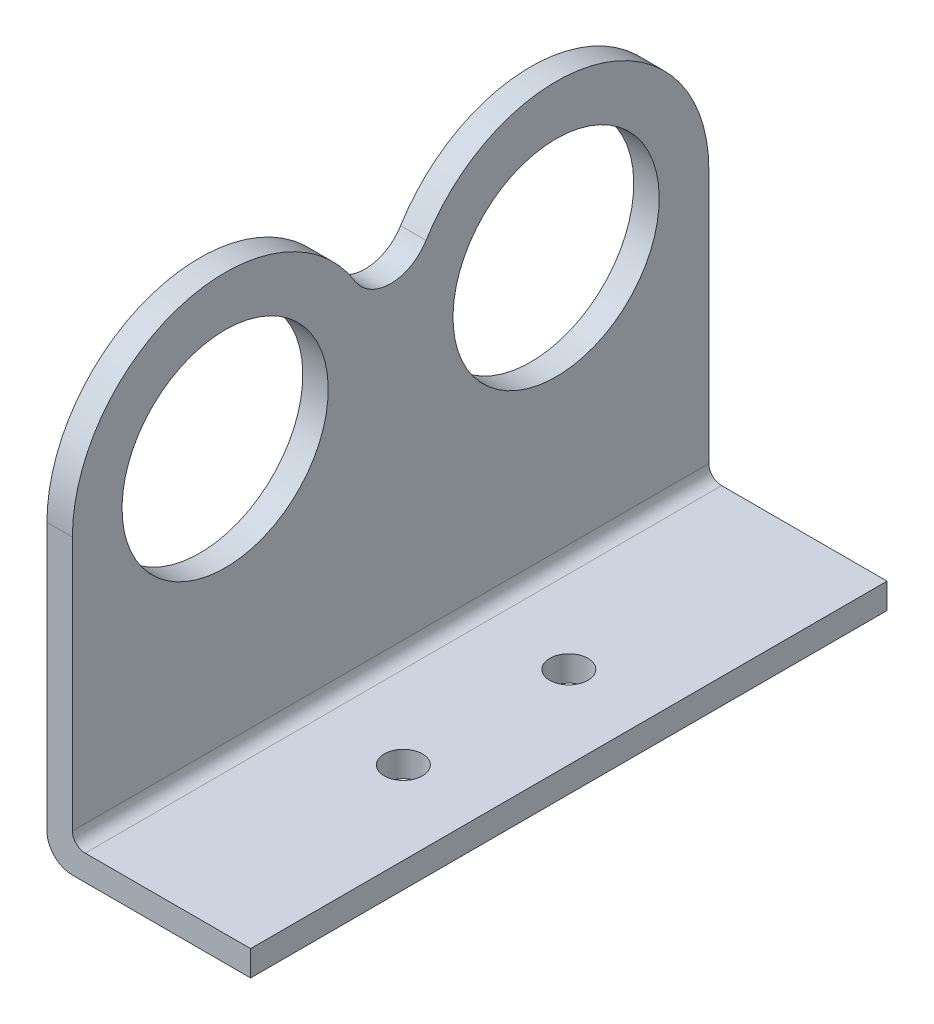
ISO-10303-21;
HEADER;
FILE_DESCRIPTION(('STEP AP214'),'2;1');
FILE_NAME('part.step','',(''),(''),'','','');
FILE_SCHEMA(('AUTOMOTIVE_DESIGN { 1 0 10303 214 1 1 1 1 }'));
ENDSEC;
DATA;
#1=APPLICATION_CONTEXT('core data for automotive mechanical design processes');
#2=APPLICATION_PROTOCOL_DEFINITION('international standard','automotive_design',2000,#1);
#3=PRODUCT_CONTEXT('',#1,'mechanical');
#4=PRODUCT('Part','Part','',(#3));
#5=PRODUCT_RELATED_PRODUCT_CATEGORY('part','',(#4));
#6=PRODUCT_DEFINITION_FORMATION('','',#4);
#7=PRODUCT_DEFINITION_CONTEXT('part definition',#1,'design');
#8=PRODUCT_DEFINITION('design','',#6,#7);
#9=PRODUCT_DEFINITION_SHAPE('','',#8);
#10=(LENGTH_UNIT() NAMED_UNIT(*) SI_UNIT(.MILLI.,.METRE.));
#11=(NAMED_UNIT(*) PLANE_ANGLE_UNIT() SI_UNIT($,.RADIAN.));
#12=(NAMED_UNIT(*) SI_UNIT($,.STERADIAN.) SOLID_ANGLE_UNIT());
#13=UNCERTAINTY_MEASURE_WITH_UNIT(LENGTH_MEASURE(1.E-05),#10,'distance_accuracy_value','');
#14=(GEOMETRIC_REPRESENTATION_CONTEXT(3) GLOBAL_UNCERTAINTY_ASSIGNED_CONTEXT((#13)) GLOBAL_UNIT_ASSIGNED_CONTEXT((#10,
#11,#12)) REPRESENTATION_CONTEXT('',''));
#15=CARTESIAN_POINT('',(0.,0.,0.));
#16=DIRECTION('',(0.,0.,1.));
#17=DIRECTION('',(1.,0.,0.));
#18=AXIS2_PLACEMENT_3D('',#15,#16,#17);
#19=CARTESIAN_POINT('',(0.,35.,50.));
#20=DIRECTION('',(1.,0.,0.));
#21=DIRECTION('',(0.,1.,0.));
#22=AXIS2_PLACEMENT_3D('',#19,#20,#21);
#23=PLANE('',#22);
#24=CARTESIAN_POINT('',(0.,23.,38.));
#25=DIRECTION('',(1.,0.,0.));
#26=DIRECTION('',(0.,1.,0.));
#27=AXIS2_PLACEMENT_3D('',#24,#25,#26);
#28=CIRCLE('',#27,8.1);
#29=CARTESIAN_POINT('',(0.,31.1,38.));
#30=VERTEX_POINT('',#29);
#31=EDGE_CURVE('E227',#30,#30,#28,.T.);
#32=ORIENTED_EDGE('',*,*,#31,.T.);
#33=EDGE_LOOP('',(#32));
#34=FACE_BOUND('',#33,.T.);
#35=CARTESIAN_POINT('',(0.,23.,12.));
#36=DIRECTION('',(1.,0.,0.));
#37=DIRECTION('',(0.,1.,0.));
#38=AXIS2_PLACEMENT_3D('',#35,#36,#37);
#39=CIRCLE('',#38,8.1);
#40=CARTESIAN_POINT('',(0.,31.1,12.));
#41=VERTEX_POINT('',#40);
#42=EDGE_CURVE('E224',#41,#41,#39,.T.);
#43=ORIENTED_EDGE('',*,*,#42,.T.);
#44=EDGE_LOOP('',(#43));
#45=FACE_BOUND('',#44,.T.);
#46=CARTESIAN_POINT('',(0.,23.,38.));
#47=DIRECTION('',(1.,0.,0.));
#48=DIRECTION('',(0.,1.,0.));
#49=AXIS2_PLACEMENT_3D('',#46,#47,#48);
#50=CIRCLE('',#49,12.);
#51=CARTESIAN_POINT('',(0.,29.289169107972,27.7801001995455));
#52=VERTEX_POINT('',#51);
#53=CARTESIAN_POINT('',(0.,23.,50.));
#54=VERTEX_POINT('',#53);
#55=EDGE_CURVE('E126',#52,#54,#50,.T.);
#56=ORIENTED_EDGE('',*,*,#55,.F.);
#57=CARTESIAN_POINT('',(0.,31.,25.));
#58=DIRECTION('',(1.,0.,0.));
#59=DIRECTION('',(0.,1.,0.));
#60=AXIS2_PLACEMENT_3D('',#57,#58,#59);
#61=CIRCLE('',#60,3.26433752247375);
#62=CARTESIAN_POINT('',(0.,29.289169107972,22.2198998004545));
#63=VERTEX_POINT('',#62);
#64=EDGE_CURVE('E202',#52,#63,#61,.T.);
#65=ORIENTED_EDGE('',*,*,#64,.T.);
#66=CARTESIAN_POINT('',(0.,23.,12.));
#67=DIRECTION('',(1.,0.,0.));
#68=DIRECTION('',(0.,1.,0.));
#69=AXIS2_PLACEMENT_3D('',#66,#67,#68);
#70=CIRCLE('',#69,12.);
#71=CARTESIAN_POINT('',(0.,23.,0.));
#72=VERTEX_POINT('',#71);
#73=EDGE_CURVE('E220',#72,#63,#70,.T.);
#74=ORIENTED_EDGE('',*,*,#73,.F.);
#75=DIRECTION('',(0.,-1.,0.));
#76=VECTOR('',#75,1.);
#77=CARTESIAN_POINT('',(0.,35.,0.));
#78=LINE('',#77,#76);
#79=CARTESIAN_POINT('',(0.,2.00000000000001,0.));
#80=VERTEX_POINT('',#79);
#81=EDGE_CURVE('E242',#72,#80,#78,.T.);
#82=ORIENTED_EDGE('',*,*,#81,.T.);
#83=DIRECTION('',(0.,0.,-1.));
#84=VECTOR('',#83,1.);
#85=CARTESIAN_POINT('',(0.,2.00000000000001,50.));
#86=LINE('',#85,#84);
#87=CARTESIAN_POINT('',(0.,2.00000000000001,50.));
#88=VERTEX_POINT('',#87);
#89=EDGE_CURVE('E281',#88,#80,#86,.T.);
#90=ORIENTED_EDGE('',*,*,#89,.F.);
#91=DIRECTION('',(0.,-1.,0.));
#92=VECTOR('',#91,1.);
#93=CARTESIAN_POINT('',(0.,35.,50.));
#94=LINE('',#93,#92);
#95=EDGE_CURVE('E245',#54,#88,#94,.T.);
#96=ORIENTED_EDGE('',*,*,#95,.F.);
#97=EDGE_LOOP('',(#56,#65,#74,#82,#90,#96));
#98=FACE_BOUND('',#97,.T.);
#99=ADVANCED_FACE('F113',(#34,#45,#98),#23,.F.);
#100=CARTESIAN_POINT('',(1.99999999999999,3.00000000000001,50.));
#101=DIRECTION('',(-1.,0.,0.));
#102=DIRECTION('',(0.,-1.,0.));
#103=AXIS2_PLACEMENT_3D('',#100,#101,#102);
#104=PLANE('',#103);
#105=CARTESIAN_POINT('',(1.99999999999999,23.,38.));
#106=DIRECTION('',(1.,0.,0.));
#107=DIRECTION('',(0.,1.,0.));
#108=AXIS2_PLACEMENT_3D('',#105,#106,#107);
#109=CIRCLE('',#108,8.1);
#110=CARTESIAN_POINT('',(1.99999999999999,31.1,38.));
#111=VERTEX_POINT('',#110);
#112=EDGE_CURVE('E198',#111,#111,#109,.T.);
#113=ORIENTED_EDGE('',*,*,#112,.F.);
#114=EDGE_LOOP('',(#113));
#115=FACE_BOUND('',#114,.T.);
#116=CARTESIAN_POINT('',(1.99999999999999,23.,12.));
#117=DIRECTION('',(1.,0.,0.));
#118=DIRECTION('',(0.,1.,0.));
#119=AXIS2_PLACEMENT_3D('',#116,#117,#118);
#120=CIRCLE('',#119,8.1);
#121=CARTESIAN_POINT('',(1.99999999999999,31.1,12.));
#122=VERTEX_POINT('',#121);
#123=EDGE_CURVE('E214',#122,#122,#120,.T.);
#124=ORIENTED_EDGE('',*,*,#123,.F.);
#125=EDGE_LOOP('',(#124));
#126=FACE_BOUND('',#125,.T.);
#127=CARTESIAN_POINT('',(1.99999999999999,31.,25.));
#128=DIRECTION('',(1.,0.,0.));
#129=DIRECTION('',(0.,1.,0.));
#130=AXIS2_PLACEMENT_3D('',#127,#128,#129);
#131=CIRCLE('',#130,3.26433752247375);
#132=CARTESIAN_POINT('',(1.99999999999999,29.289169107972,27.7801001995455));
#133=VERTEX_POINT('',#132);
#134=CARTESIAN_POINT('',(1.99999999999999,29.289169107972,22.2198998004545));
#135=VERTEX_POINT('',#134);
#136=EDGE_CURVE('E201',#133,#135,#131,.T.);
#137=ORIENTED_EDGE('',*,*,#136,.F.);
#138=CARTESIAN_POINT('',(1.99999999999999,23.,38.));
#139=DIRECTION('',(1.,0.,0.));
#140=DIRECTION('',(0.,1.,0.));
#141=AXIS2_PLACEMENT_3D('',#138,#139,#140);
#142=CIRCLE('',#141,12.);
#143=CARTESIAN_POINT('',(1.99999999999999,23.,50.));
#144=VERTEX_POINT('',#143);
#145=EDGE_CURVE('E189',#133,#144,#142,.T.);
#146=ORIENTED_EDGE('',*,*,#145,.T.);
#147=DIRECTION('',(0.,1.,0.));
#148=VECTOR('',#147,1.);
#149=CARTESIAN_POINT('',(1.99999999999999,3.00000000000001,50.));
#150=LINE('',#149,#148);
#151=CARTESIAN_POINT('',(1.99999999999999,3.00000000000001,50.));
#152=VERTEX_POINT('',#151);
#153=EDGE_CURVE('E254',#152,#144,#150,.T.);
#154=ORIENTED_EDGE('',*,*,#153,.F.);
#155=DIRECTION('',(0.,0.,-1.));
#156=VECTOR('',#155,1.);
#157=CARTESIAN_POINT('',(1.99999999999999,3.00000000000001,50.));
#158=LINE('',#157,#156);
#159=CARTESIAN_POINT('',(1.99999999999999,3.00000000000001,0.));
#160=VERTEX_POINT('',#159);
#161=EDGE_CURVE('E260',#152,#160,#158,.T.);
#162=ORIENTED_EDGE('',*,*,#161,.T.);
#163=DIRECTION('',(0.,1.,0.));
#164=VECTOR('',#163,1.);
#165=CARTESIAN_POINT('',(1.99999999999999,3.00000000000001,0.));
#166=LINE('',#165,#164);
#167=CARTESIAN_POINT('',(1.99999999999999,23.,0.));
#168=VERTEX_POINT('',#167);
#169=EDGE_CURVE('E243',#160,#168,#166,.T.);
#170=ORIENTED_EDGE('',*,*,#169,.T.);
#171=CARTESIAN_POINT('',(1.99999999999999,23.,12.));
#172=DIRECTION('',(1.,0.,0.));
#173=DIRECTION('',(0.,1.,0.));
#174=AXIS2_PLACEMENT_3D('',#171,#172,#173);
#175=CIRCLE('',#174,12.);
#176=EDGE_CURVE('E137',#168,#135,#175,.T.);
#177=ORIENTED_EDGE('',*,*,#176,.T.);
#178=EDGE_LOOP('',(#137,#146,#154,#162,#170,#177));
#179=FACE_BOUND('',#178,.T.);
#180=ADVANCED_FACE('F208',(#115,#126,#179),#104,.F.);
#181=CARTESIAN_POINT('',(2.,2.,50.));
#182=DIRECTION('',(0.,0.,-1.));
#183=DIRECTION('',(-1.,0.,0.));
#184=AXIS2_PLACEMENT_3D('',#181,#182,#183);
#185=CYLINDRICAL_SURFACE('',#184,2.);
#186=CARTESIAN_POINT('',(2.,2.,0.));
#187=DIRECTION('',(0.,0.,1.));
#188=DIRECTION('',(1.,0.,0.));
#189=AXIS2_PLACEMENT_3D('',#186,#187,#188);
#190=CIRCLE('',#189,2.);
#191=CARTESIAN_POINT('',(2.00000000000001,0.,0.));
#192=VERTEX_POINT('',#191);
#193=EDGE_CURVE('E259',#80,#192,#190,.T.);
#194=ORIENTED_EDGE('',*,*,#193,.T.);
#195=DIRECTION('',(0.,0.,-1.));
#196=VECTOR('',#195,1.);
#197=CARTESIAN_POINT('',(2.00000000000001,0.,50.));
#198=LINE('',#197,#196);
#199=CARTESIAN_POINT('',(2.00000000000001,0.,50.));
#200=VERTEX_POINT('',#199);
#201=EDGE_CURVE('E282',#200,#192,#198,.T.);
#202=ORIENTED_EDGE('',*,*,#201,.F.);
#203=CARTESIAN_POINT('',(2.,2.,50.));
#204=DIRECTION('',(0.,0.,1.));
#205=DIRECTION('',(1.,0.,0.));
#206=AXIS2_PLACEMENT_3D('',#203,#204,#205);
#207=CIRCLE('',#206,2.);
#208=EDGE_CURVE('E241',#88,#200,#207,.T.);
#209=ORIENTED_EDGE('',*,*,#208,.F.);
#210=ORIENTED_EDGE('',*,*,#89,.T.);
#211=EDGE_LOOP('',(#194,#202,#209,#210));
#212=FACE_BOUND('',#211,.T.);
#213=ADVANCED_FACE('F314',(#212),#185,.T.);
#214=CARTESIAN_POINT('',(2.00000000000001,0.,50.));
#215=DIRECTION('',(0.,1.,0.));
#216=DIRECTION('',(0.,0.,1.));
#217=AXIS2_PLACEMENT_3D('',#214,#215,#216);
#218=PLANE('',#217);
#219=CARTESIAN_POINT('',(9.5,0.,18.5));
#220=DIRECTION('',(0.,1.,0.));
#221=DIRECTION('',(0.,0.,1.));
#222=AXIS2_PLACEMENT_3D('',#219,#220,#221);
#223=CIRCLE('',#222,1.5);
#224=CARTESIAN_POINT('',(9.5,0.,20.));
#225=VERTEX_POINT('',#224);
#226=EDGE_CURVE('E236',#225,#225,#223,.T.);
#227=ORIENTED_EDGE('',*,*,#226,.T.);
#228=EDGE_LOOP('',(#227));
#229=FACE_BOUND('',#228,.T.);
#230=CARTESIAN_POINT('',(9.5,0.,31.5));
#231=DIRECTION('',(0.,1.,0.));
#232=DIRECTION('',(0.,0.,1.));
#233=AXIS2_PLACEMENT_3D('',#230,#231,#232);
#234=CIRCLE('',#233,1.5);
#235=CARTESIAN_POINT('',(9.5,0.,33.));
#236=VERTEX_POINT('',#235);
#237=EDGE_CURVE('E234',#236,#236,#234,.T.);
#238=ORIENTED_EDGE('',*,*,#237,.T.);
#239=EDGE_LOOP('',(#238));
#240=FACE_BOUND('',#239,.T.);
#241=DIRECTION('',(1.,0.,0.));
#242=VECTOR('',#241,1.);
#243=CARTESIAN_POINT('',(2.00000000000001,0.,0.));
#244=LINE('',#243,#242);
#245=CARTESIAN_POINT('',(16.,0.,0.));
#246=VERTEX_POINT('',#245);
#247=EDGE_CURVE('E261',#192,#246,#244,.T.);
#248=ORIENTED_EDGE('',*,*,#247,.T.);
#249=DIRECTION('',(0.,0.,-1.));
#250=VECTOR('',#249,1.);
#251=CARTESIAN_POINT('',(16.,0.,50.));
#252=LINE('',#251,#250);
#253=CARTESIAN_POINT('',(16.,0.,50.));
#254=VERTEX_POINT('',#253);
#255=EDGE_CURVE('E279',#254,#246,#252,.T.);
#256=ORIENTED_EDGE('',*,*,#255,.F.);
#257=DIRECTION('',(1.,0.,0.));
#258=VECTOR('',#257,1.);
#259=CARTESIAN_POINT('',(2.00000000000001,0.,50.));
#260=LINE('',#259,#258);
#261=EDGE_CURVE('E250',#200,#254,#260,.T.);
#262=ORIENTED_EDGE('',*,*,#261,.F.);
#263=ORIENTED_EDGE('',*,*,#201,.T.);
#264=EDGE_LOOP('',(#248,#256,#262,#263));
#265=FACE_BOUND('',#264,.T.);
#266=ADVANCED_FACE('F313',(#229,#240,#265),#218,.F.);
#267=CARTESIAN_POINT('',(16.,0.,50.));
#268=DIRECTION('',(-1.,0.,0.));
#269=DIRECTION('',(0.,-1.,0.));
#270=AXIS2_PLACEMENT_3D('',#267,#268,#269);
#271=PLANE('',#270);
#272=DIRECTION('',(0.,1.,0.));
#273=VECTOR('',#272,1.);
#274=CARTESIAN_POINT('',(16.,0.,0.));
#275=LINE('',#274,#273);
#276=CARTESIAN_POINT('',(16.,2.,0.));
#277=VERTEX_POINT('',#276);
#278=EDGE_CURVE('E263',#246,#277,#275,.T.);
#279=ORIENTED_EDGE('',*,*,#278,.T.);
#280=DIRECTION('',(0.,0.,-1.));
#281=VECTOR('',#280,1.);
#282=CARTESIAN_POINT('',(16.,2.,50.));
#283=LINE('',#282,#281);
#284=CARTESIAN_POINT('',(16.,2.,50.));
#285=VERTEX_POINT('',#284);
#286=EDGE_CURVE('E274',#285,#277,#283,.T.);
#287=ORIENTED_EDGE('',*,*,#286,.F.);
#288=DIRECTION('',(0.,1.,0.));
#289=VECTOR('',#288,1.);
#290=CARTESIAN_POINT('',(16.,0.,50.));
#291=LINE('',#290,#289);
#292=EDGE_CURVE('E246',#254,#285,#291,.T.);
#293=ORIENTED_EDGE('',*,*,#292,.F.);
#294=ORIENTED_EDGE('',*,*,#255,.T.);
#295=EDGE_LOOP('',(#279,#287,#293,#294));
#296=FACE_BOUND('',#295,.T.);
#297=ADVANCED_FACE('F307',(#296),#271,.F.);
#298=CARTESIAN_POINT('',(16.,2.,50.));
#299=DIRECTION('',(0.,-1.,0.));
#300=DIRECTION('',(0.,0.,-1.));
#301=AXIS2_PLACEMENT_3D('',#298,#299,#300);
#302=PLANE('',#301);
#303=CARTESIAN_POINT('',(9.5,2.,18.5));
#304=DIRECTION('',(0.,1.,0.));
#305=DIRECTION('',(0.,0.,1.));
#306=AXIS2_PLACEMENT_3D('',#303,#304,#305);
#307=CIRCLE('',#306,1.5);
#308=CARTESIAN_POINT('',(9.5,2.,20.));
#309=VERTEX_POINT('',#308);
#310=EDGE_CURVE('E228',#309,#309,#307,.T.);
#311=ORIENTED_EDGE('',*,*,#310,.F.);
#312=EDGE_LOOP('',(#311));
#313=FACE_BOUND('',#312,.T.);
#314=CARTESIAN_POINT('',(9.5,2.,31.5));
#315=DIRECTION('',(0.,1.,0.));
#316=DIRECTION('',(0.,0.,1.));
#317=AXIS2_PLACEMENT_3D('',#314,#315,#316);
#318=CIRCLE('',#317,1.5);
#319=CARTESIAN_POINT('',(9.5,2.,33.));
#320=VERTEX_POINT('',#319);
#321=EDGE_CURVE('E226',#320,#320,#318,.T.);
#322=ORIENTED_EDGE('',*,*,#321,.F.);
#323=EDGE_LOOP('',(#322));
#324=FACE_BOUND('',#323,.T.);
#325=DIRECTION('',(-1.,0.,0.));
#326=VECTOR('',#325,1.);
#327=CARTESIAN_POINT('',(16.,2.,0.));
#328=LINE('',#327,#326);
#329=CARTESIAN_POINT('',(3.,2.,0.));
#330=VERTEX_POINT('',#329);
#331=EDGE_CURVE('E264',#277,#330,#328,.T.);
#332=ORIENTED_EDGE('',*,*,#331,.T.);
#333=DIRECTION('',(0.,0.,-1.));
#334=VECTOR('',#333,1.);
#335=CARTESIAN_POINT('',(3.,2.,50.));
#336=LINE('',#335,#334);
#337=CARTESIAN_POINT('',(3.,2.,50.));
#338=VERTEX_POINT('',#337);
#339=EDGE_CURVE('E275',#338,#330,#336,.T.);
#340=ORIENTED_EDGE('',*,*,#339,.F.);
#341=DIRECTION('',(-1.,0.,0.));
#342=VECTOR('',#341,1.);
#343=CARTESIAN_POINT('',(16.,2.,50.));
#344=LINE('',#343,#342);
#345=EDGE_CURVE('E253',#285,#338,#344,.T.);
#346=ORIENTED_EDGE('',*,*,#345,.F.);
#347=ORIENTED_EDGE('',*,*,#286,.T.);
#348=EDGE_LOOP('',(#332,#340,#346,#347));
#349=FACE_BOUND('',#348,.T.);
#350=ADVANCED_FACE('F305',(#313,#324,#349),#302,.F.);
#351=CARTESIAN_POINT('',(2.99999999999999,3.,50.));
#352=DIRECTION('',(0.,0.,-1.));
#353=DIRECTION('',(-1.,0.,0.));
#354=AXIS2_PLACEMENT_3D('',#351,#352,#353);
#355=CYLINDRICAL_SURFACE('',#354,1.);
#356=CARTESIAN_POINT('',(2.99999999999999,3.,0.));
#357=DIRECTION('',(0.,0.,-1.));
#358=DIRECTION('',(1.,0.,0.));
#359=AXIS2_PLACEMENT_3D('',#356,#357,#358);
#360=CIRCLE('',#359,1.);
#361=EDGE_CURVE('E270',#330,#160,#360,.T.);
#362=ORIENTED_EDGE('',*,*,#361,.T.);
#363=ORIENTED_EDGE('',*,*,#161,.F.);
#364=CARTESIAN_POINT('',(2.99999999999999,3.,50.));
#365=DIRECTION('',(0.,0.,-1.));
#366=DIRECTION('',(1.,0.,0.));
#367=AXIS2_PLACEMENT_3D('',#364,#365,#366);
#368=CIRCLE('',#367,1.);
#369=EDGE_CURVE('E251',#338,#152,#368,.T.);
#370=ORIENTED_EDGE('',*,*,#369,.F.);
#371=ORIENTED_EDGE('',*,*,#339,.T.);
#372=EDGE_LOOP('',(#362,#363,#370,#371));
#373=FACE_BOUND('',#372,.T.);
#374=ADVANCED_FACE('F297',(#373),#355,.F.);
#375=CARTESIAN_POINT('',(2.,2.,50.));
#376=DIRECTION('',(0.,0.,1.));
#377=DIRECTION('',(1.,0.,0.));
#378=AXIS2_PLACEMENT_3D('',#375,#376,#377);
#379=PLANE('',#378);
#380=DIRECTION('',(1.,0.,0.));
#381=VECTOR('',#380,1.);
#382=CARTESIAN_POINT('',(-48.,23.,50.));
#383=LINE('',#382,#381);
#384=EDGE_CURVE('E12',#54,#144,#383,.T.);
#385=ORIENTED_EDGE('',*,*,#384,.F.);
#386=ORIENTED_EDGE('',*,*,#95,.T.);
#387=ORIENTED_EDGE('',*,*,#208,.T.);
#388=ORIENTED_EDGE('',*,*,#261,.T.);
#389=ORIENTED_EDGE('',*,*,#292,.T.);
#390=ORIENTED_EDGE('',*,*,#345,.T.);
#391=ORIENTED_EDGE('',*,*,#369,.T.);
#392=ORIENTED_EDGE('',*,*,#153,.T.);
#393=EDGE_LOOP('',(#385,#386,#387,#388,#389,#390,#391,#392));
#394=FACE_BOUND('',#393,.T.);
#395=ADVANCED_FACE('F359',(#394),#379,.T.);
#396=CARTESIAN_POINT('',(2.,2.,0.));
#397=DIRECTION('',(0.,0.,1.));
#398=DIRECTION('',(1.,0.,0.));
#399=AXIS2_PLACEMENT_3D('',#396,#397,#398);
#400=PLANE('',#399);
#401=ORIENTED_EDGE('',*,*,#81,.F.);
#402=DIRECTION('',(1.,0.,0.));
#403=VECTOR('',#402,1.);
#404=CARTESIAN_POINT('',(-48.,23.,0.));
#405=LINE('',#404,#403);
#406=EDGE_CURVE('E125',#72,#168,#405,.T.);
#407=ORIENTED_EDGE('',*,*,#406,.T.);
#408=ORIENTED_EDGE('',*,*,#169,.F.);
#409=ORIENTED_EDGE('',*,*,#361,.F.);
#410=ORIENTED_EDGE('',*,*,#331,.F.);
#411=ORIENTED_EDGE('',*,*,#278,.F.);
#412=ORIENTED_EDGE('',*,*,#247,.F.);
#413=ORIENTED_EDGE('',*,*,#193,.F.);
#414=EDGE_LOOP('',(#401,#407,#408,#409,#410,#411,#412,#413));
#415=FACE_BOUND('',#414,.T.);
#416=ADVANCED_FACE('F286',(#415),#400,.F.);
#417=CARTESIAN_POINT('',(9.5,-48.,31.5));
#418=DIRECTION('',(0.,1.,0.));
#419=DIRECTION('',(0.,0.,1.));
#420=AXIS2_PLACEMENT_3D('',#417,#418,#419);
#421=CYLINDRICAL_SURFACE('',#420,1.5);
#422=ORIENTED_EDGE('',*,*,#321,.T.);
#423=EDGE_LOOP('',(#422));
#424=FACE_BOUND('',#423,.T.);
#425=ORIENTED_EDGE('',*,*,#237,.F.);
#426=EDGE_LOOP('',(#425));
#427=FACE_BOUND('',#426,.T.);
#428=ADVANCED_FACE('F329',(#424,#427),#421,.F.);
#429=CARTESIAN_POINT('',(9.5,-48.,18.5));
#430=DIRECTION('',(0.,1.,0.));
#431=DIRECTION('',(0.,0.,1.));
#432=AXIS2_PLACEMENT_3D('',#429,#430,#431);
#433=CYLINDRICAL_SURFACE('',#432,1.5);
#434=ORIENTED_EDGE('',*,*,#310,.T.);
#435=EDGE_LOOP('',(#434));
#436=FACE_BOUND('',#435,.T.);
#437=ORIENTED_EDGE('',*,*,#226,.F.);
#438=EDGE_LOOP('',(#437));
#439=FACE_BOUND('',#438,.T.);
#440=ADVANCED_FACE('F321',(#436,#439),#433,.F.);
#441=CARTESIAN_POINT('',(-48.,23.,12.));
#442=DIRECTION('',(1.,0.,0.));
#443=DIRECTION('',(0.,1.,0.));
#444=AXIS2_PLACEMENT_3D('',#441,#442,#443);
#445=CYLINDRICAL_SURFACE('',#444,12.);
#446=ORIENTED_EDGE('',*,*,#73,.T.);
#447=DIRECTION('',(1.,0.,0.));
#448=VECTOR('',#447,1.);
#449=CARTESIAN_POINT('',(-48.,29.289169107972,22.2198998004545));
#450=LINE('',#449,#448);
#451=EDGE_CURVE('E206',#63,#135,#450,.T.);
#452=ORIENTED_EDGE('',*,*,#451,.T.);
#453=ORIENTED_EDGE('',*,*,#176,.F.);
#454=ORIENTED_EDGE('',*,*,#406,.F.);
#455=EDGE_LOOP('',(#446,#452,#453,#454));
#456=FACE_BOUND('',#455,.T.);
#457=ADVANCED_FACE('F317',(#456),#445,.T.);
#458=CARTESIAN_POINT('',(-48.,23.,38.));
#459=DIRECTION('',(1.,0.,0.));
#460=DIRECTION('',(0.,1.,0.));
#461=AXIS2_PLACEMENT_3D('',#458,#459,#460);
#462=CYLINDRICAL_SURFACE('',#461,12.);
#463=ORIENTED_EDGE('',*,*,#55,.T.);
#464=ORIENTED_EDGE('',*,*,#384,.T.);
#465=ORIENTED_EDGE('',*,*,#145,.F.);
#466=DIRECTION('',(1.,0.,0.));
#467=VECTOR('',#466,1.);
#468=CARTESIAN_POINT('',(-48.,29.289169107972,27.7801001995455));
#469=LINE('',#468,#467);
#470=EDGE_CURVE('E192',#52,#133,#469,.T.);
#471=ORIENTED_EDGE('',*,*,#470,.F.);
#472=EDGE_LOOP('',(#463,#464,#465,#471));
#473=FACE_BOUND('',#472,.T.);
#474=ADVANCED_FACE('F188',(#473),#462,.T.);
#475=CARTESIAN_POINT('',(-48.,23.,12.));
#476=DIRECTION('',(1.,0.,0.));
#477=DIRECTION('',(0.,1.,0.));
#478=AXIS2_PLACEMENT_3D('',#475,#476,#477);
#479=CYLINDRICAL_SURFACE('',#478,8.1);
#480=ORIENTED_EDGE('',*,*,#123,.T.);
#481=EDGE_LOOP('',(#480));
#482=FACE_BOUND('',#481,.T.);
#483=ORIENTED_EDGE('',*,*,#42,.F.);
#484=EDGE_LOOP('',(#483));
#485=FACE_BOUND('',#484,.T.);
#486=ADVANCED_FACE('F330',(#482,#485),#479,.F.);
#487=CARTESIAN_POINT('',(-48.,23.,38.));
#488=DIRECTION('',(1.,0.,0.));
#489=DIRECTION('',(0.,1.,0.));
#490=AXIS2_PLACEMENT_3D('',#487,#488,#489);
#491=CYLINDRICAL_SURFACE('',#490,8.1);
#492=ORIENTED_EDGE('',*,*,#112,.T.);
#493=EDGE_LOOP('',(#492));
#494=FACE_BOUND('',#493,.T.);
#495=ORIENTED_EDGE('',*,*,#31,.F.);
#496=EDGE_LOOP('',(#495));
#497=FACE_BOUND('',#496,.T.);
#498=ADVANCED_FACE('F350',(#494,#497),#491,.F.);
#499=CARTESIAN_POINT('',(-48.,31.,25.));
#500=DIRECTION('',(1.,0.,0.));
#501=DIRECTION('',(0.,1.,0.));
#502=AXIS2_PLACEMENT_3D('',#499,#500,#501);
#503=CYLINDRICAL_SURFACE('',#502,3.26433752247375);
#504=ORIENTED_EDGE('',*,*,#470,.T.);
#505=ORIENTED_EDGE('',*,*,#136,.T.);
#506=ORIENTED_EDGE('',*,*,#451,.F.);
#507=ORIENTED_EDGE('',*,*,#64,.F.);
#508=EDGE_LOOP('',(#504,#505,#506,#507));
#509=FACE_BOUND('',#508,.T.);
#510=ADVANCED_FACE('F203',(#509),#503,.F.);
#511=CLOSED_SHELL('',(#99,#180,#213,#266,#297,#350,#374,#395,#416,#428,#440,#457,#474,#486,#498,#510));
#512=MANIFOLD_SOLID_BREP('B2',#511);
#513=ADVANCED_BREP_SHAPE_REPRESENTATION('',(#18,#512),#14);
#514=SHAPE_DEFINITION_REPRESENTATION(#9,#513);
ENDSEC;
END-ISO-10303-21;
